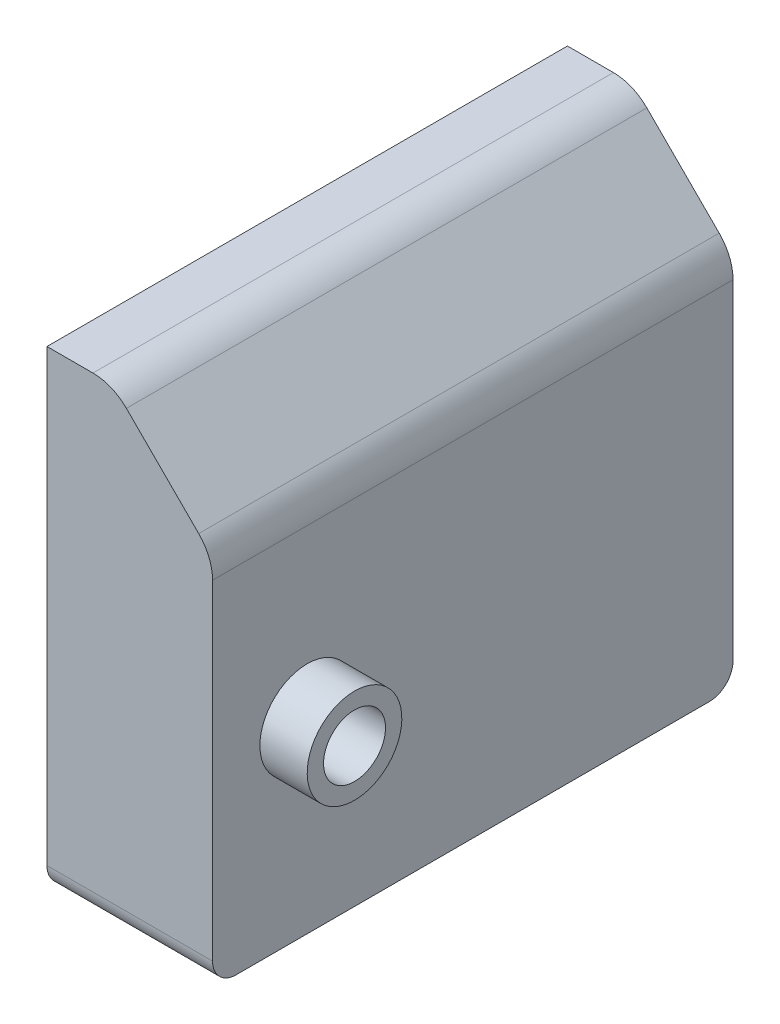
ISO-10303-21;
HEADER;
FILE_DESCRIPTION(('STEP AP214'),'2;1');
FILE_NAME('part.step','',(''),(''),'','','');
FILE_SCHEMA(('AUTOMOTIVE_DESIGN { 1 0 10303 214 1 1 1 1 }'));
ENDSEC;
DATA;
#1=APPLICATION_CONTEXT('core data for automotive mechanical design processes');
#2=APPLICATION_PROTOCOL_DEFINITION('international standard','automotive_design',2000,#1);
#3=PRODUCT_CONTEXT('',#1,'mechanical');
#4=PRODUCT('Part','Part','',(#3));
#5=PRODUCT_RELATED_PRODUCT_CATEGORY('part','',(#4));
#6=PRODUCT_DEFINITION_FORMATION('','',#4);
#7=PRODUCT_DEFINITION_CONTEXT('part definition',#1,'design');
#8=PRODUCT_DEFINITION('design','',#6,#7);
#9=PRODUCT_DEFINITION_SHAPE('','',#8);
#10=(LENGTH_UNIT() NAMED_UNIT(*) SI_UNIT(.MILLI.,.METRE.));
#11=(NAMED_UNIT(*) PLANE_ANGLE_UNIT() SI_UNIT($,.RADIAN.));
#12=(NAMED_UNIT(*) SI_UNIT($,.STERADIAN.) SOLID_ANGLE_UNIT());
#13=UNCERTAINTY_MEASURE_WITH_UNIT(LENGTH_MEASURE(1.E-05),#10,'distance_accuracy_value','');
#14=(GEOMETRIC_REPRESENTATION_CONTEXT(3) GLOBAL_UNCERTAINTY_ASSIGNED_CONTEXT((#13)) GLOBAL_UNIT_ASSIGNED_CONTEXT((#10,
#11,#12)) REPRESENTATION_CONTEXT('',''));
#15=CARTESIAN_POINT('',(0.,0.,0.));
#16=DIRECTION('',(0.,0.,1.));
#17=DIRECTION('',(1.,0.,0.));
#18=AXIS2_PLACEMENT_3D('',#15,#16,#17);
#19=CARTESIAN_POINT('',(1.,-21.7427164815951,-2.));
#20=DIRECTION('',(-1.,0.,0.));
#21=DIRECTION('',(0.,-1.,0.));
#22=AXIS2_PLACEMENT_3D('',#19,#20,#21);
#23=PLANE('',#22);
#24=DIRECTION('',(0.,0.,1.));
#25=VECTOR('',#24,1.);
#26=CARTESIAN_POINT('',(1.,-119.742716481595,-213.948100502086));
#27=LINE('',#26,#25);
#28=CARTESIAN_POINT('',(1.,-119.742716481595,-103.));
#29=VERTEX_POINT('',#28);
#30=CARTESIAN_POINT('',(1.,-119.742716481595,-7.00000000000006));
#31=VERTEX_POINT('',#30);
#32=EDGE_CURVE('E208',#29,#31,#27,.T.);
#33=ORIENTED_EDGE('',*,*,#32,.F.);
#34=CARTESIAN_POINT('',(1.,-114.742716481595,-103.));
#35=DIRECTION('',(-1.,0.,0.));
#36=DIRECTION('',(0.,-1.,0.));
#37=AXIS2_PLACEMENT_3D('',#34,#35,#36);
#38=CIRCLE('',#37,5.);
#39=CARTESIAN_POINT('',(1.,-114.742716481595,-108.));
#40=VERTEX_POINT('',#39);
#41=EDGE_CURVE('E267',#29,#40,#38,.F.);
#42=ORIENTED_EDGE('',*,*,#41,.T.);
#43=DIRECTION('',(0.,1.,0.));
#44=VECTOR('',#43,1.);
#45=CARTESIAN_POINT('',(1.,-121.742716481595,-108.));
#46=LINE('',#45,#44);
#47=CARTESIAN_POINT('',(1.,-23.7427164815951,-108.));
#48=VERTEX_POINT('',#47);
#49=EDGE_CURVE('E192',#40,#48,#46,.T.);
#50=ORIENTED_EDGE('',*,*,#49,.T.);
#51=DIRECTION('',(0.,0.,1.));
#52=VECTOR('',#51,1.);
#53=CARTESIAN_POINT('',(1.,-23.7427164815951,-213.948100502086));
#54=LINE('',#53,#52);
#55=CARTESIAN_POINT('',(1.,-23.7427164815951,-2.));
#56=VERTEX_POINT('',#55);
#57=EDGE_CURVE('E195',#48,#56,#54,.T.);
#58=ORIENTED_EDGE('',*,*,#57,.T.);
#59=DIRECTION('',(0.,-1.,0.));
#60=VECTOR('',#59,1.);
#61=CARTESIAN_POINT('',(1.,-21.7427164815951,-2.));
#62=LINE('',#61,#60);
#63=CARTESIAN_POINT('',(1.,-114.742716481595,-2.));
#64=VERTEX_POINT('',#63);
#65=EDGE_CURVE('E215',#56,#64,#62,.T.);
#66=ORIENTED_EDGE('',*,*,#65,.T.);
#67=CARTESIAN_POINT('',(1.,-114.742716481595,-7.00000000000001));
#68=DIRECTION('',(-1.,0.,0.));
#69=DIRECTION('',(0.,-1.,0.));
#70=AXIS2_PLACEMENT_3D('',#67,#68,#69);
#71=CIRCLE('',#70,5.);
#72=EDGE_CURVE('E265',#64,#31,#71,.F.);
#73=ORIENTED_EDGE('',*,*,#72,.T.);
#74=EDGE_LOOP('',(#33,#42,#50,#58,#66,#73));
#75=FACE_BOUND('',#74,.T.);
#76=DIRECTION('',(0.,1.,0.));
#77=VECTOR('',#76,1.);
#78=CARTESIAN_POINT('',(1.,-121.742716481595,-110.));
#79=LINE('',#78,#77);
#80=CARTESIAN_POINT('',(1.,-116.742716481595,-110.));
#81=VERTEX_POINT('',#80);
#82=CARTESIAN_POINT('',(1.,-21.742716481595,-110.));
#83=VERTEX_POINT('',#82);
#84=EDGE_CURVE('E161',#81,#83,#79,.T.);
#85=ORIENTED_EDGE('',*,*,#84,.F.);
#86=CARTESIAN_POINT('',(1.,-116.742716481595,-105.));
#87=DIRECTION('',(-1.,0.,0.));
#88=DIRECTION('',(0.,-1.,0.));
#89=AXIS2_PLACEMENT_3D('',#86,#87,#88);
#90=CIRCLE('',#89,5.);
#91=CARTESIAN_POINT('',(1.,-121.742716481595,-105.));
#92=VERTEX_POINT('',#91);
#93=EDGE_CURVE('E251',#81,#92,#90,.T.);
#94=ORIENTED_EDGE('',*,*,#93,.T.);
#95=DIRECTION('',(0.,0.,1.));
#96=VECTOR('',#95,1.);
#97=CARTESIAN_POINT('',(1.,-121.742716481595,-2.));
#98=LINE('',#97,#96);
#99=CARTESIAN_POINT('',(1.,-121.742716481595,-5.));
#100=VERTEX_POINT('',#99);
#101=EDGE_CURVE('E218',#92,#100,#98,.T.);
#102=ORIENTED_EDGE('',*,*,#101,.T.);
#103=CARTESIAN_POINT('',(1.,-116.742716481595,-5.));
#104=DIRECTION('',(-1.,0.,0.));
#105=DIRECTION('',(0.,-1.,0.));
#106=AXIS2_PLACEMENT_3D('',#103,#104,#105);
#107=CIRCLE('',#106,5.);
#108=CARTESIAN_POINT('',(1.,-116.742716481595,0.));
#109=VERTEX_POINT('',#108);
#110=EDGE_CURVE('E249',#100,#109,#107,.T.);
#111=ORIENTED_EDGE('',*,*,#110,.T.);
#112=DIRECTION('',(0.,-1.,0.));
#113=VECTOR('',#112,1.);
#114=CARTESIAN_POINT('',(1.,-21.7427164815951,0.));
#115=LINE('',#114,#113);
#116=CARTESIAN_POINT('',(1.,-21.7427164815951,0.));
#117=VERTEX_POINT('',#116);
#118=EDGE_CURVE('E177',#117,#109,#115,.T.);
#119=ORIENTED_EDGE('',*,*,#118,.F.);
#120=DIRECTION('',(0.,0.,1.));
#121=VECTOR('',#120,1.);
#122=CARTESIAN_POINT('',(1.,-21.7427164815951,-2.));
#123=LINE('',#122,#121);
#124=EDGE_CURVE('E175',#83,#117,#123,.T.);
#125=ORIENTED_EDGE('',*,*,#124,.F.);
#126=EDGE_LOOP('',(#85,#94,#102,#111,#119,#125));
#127=FACE_BOUND('',#126,.T.);
#128=ADVANCED_FACE('F33',(#75,#127),#23,.T.);
#129=CARTESIAN_POINT('',(1.,-21.7427164815951,-2.));
#130=DIRECTION('',(0.,1.,0.));
#131=DIRECTION('',(0.,0.,1.));
#132=AXIS2_PLACEMENT_3D('',#129,#130,#131);
#133=PLANE('',#132);
#134=DIRECTION('',(-1.,0.,0.));
#135=VECTOR('',#134,1.);
#136=CARTESIAN_POINT('',(1.,-21.7427164815951,0.));
#137=LINE('',#136,#135);
#138=CARTESIAN_POINT('',(10.7179817021291,-21.7427164815951,0.));
#139=VERTEX_POINT('',#138);
#140=EDGE_CURVE('E219',#139,#117,#137,.T.);
#141=ORIENTED_EDGE('',*,*,#140,.F.);
#142=DIRECTION('',(0.,0.,1.));
#143=VECTOR('',#142,1.);
#144=CARTESIAN_POINT('',(10.7179817021292,-21.7427164815951,-2.));
#145=LINE('',#144,#143);
#146=CARTESIAN_POINT('',(10.7179817021291,-21.742716481595,-110.));
#147=VERTEX_POINT('',#146);
#148=EDGE_CURVE('E11',#139,#147,#145,.F.);
#149=ORIENTED_EDGE('',*,*,#148,.T.);
#150=DIRECTION('',(1.,0.,0.));
#151=VECTOR('',#150,1.);
#152=CARTESIAN_POINT('',(1.,-21.742716481595,-110.));
#153=LINE('',#152,#151);
#154=EDGE_CURVE('E166',#83,#147,#153,.T.);
#155=ORIENTED_EDGE('',*,*,#154,.F.);
#156=ORIENTED_EDGE('',*,*,#124,.T.);
#157=EDGE_LOOP('',(#141,#149,#155,#156));
#158=FACE_BOUND('',#157,.T.);
#159=ADVANCED_FACE('F183',(#158),#133,.T.);
#160=CARTESIAN_POINT('',(14.8601173258601,-21.7427164815951,-2.));
#161=DIRECTION('',(0.707106781186549,0.707106781186546,0.));
#162=DIRECTION('',(-0.707106781186546,0.707106781186549,0.));
#163=AXIS2_PLACEMENT_3D('',#160,#161,#162);
#164=PLANE('',#163);
#165=DIRECTION('',(-0.707106781186546,0.707106781186549,0.));
#166=VECTOR('',#165,1.);
#167=CARTESIAN_POINT('',(14.8601173258601,-21.7427164815951,0.));
#168=LINE('',#167,#166);
#169=CARTESIAN_POINT('',(33.0710678118655,-39.9536669676005,0.));
#170=VERTEX_POINT('',#169);
#171=CARTESIAN_POINT('',(17.7890495139946,-24.6716486697296,0.));
#172=VERTEX_POINT('',#171);
#173=EDGE_CURVE('E224',#170,#172,#168,.T.);
#174=ORIENTED_EDGE('',*,*,#173,.F.);
#175=DIRECTION('',(0.,0.,1.));
#176=VECTOR('',#175,1.);
#177=CARTESIAN_POINT('',(33.0710678118655,-39.9536669676005,-2.));
#178=LINE('',#177,#176);
#179=CARTESIAN_POINT('',(33.0710678118655,-39.9536669676005,-110.));
#180=VERTEX_POINT('',#179);
#181=EDGE_CURVE('E279',#170,#180,#178,.F.);
#182=ORIENTED_EDGE('',*,*,#181,.T.);
#183=DIRECTION('',(0.707106781186546,-0.707106781186549,0.));
#184=VECTOR('',#183,1.);
#185=CARTESIAN_POINT('',(14.8601173258601,-21.742716481595,-110.));
#186=LINE('',#185,#184);
#187=CARTESIAN_POINT('',(17.7890495139947,-24.6716486697296,-110.));
#188=VERTEX_POINT('',#187);
#189=EDGE_CURVE('E185',#188,#180,#186,.T.);
#190=ORIENTED_EDGE('',*,*,#189,.F.);
#191=DIRECTION('',(0.,0.,1.));
#192=VECTOR('',#191,1.);
#193=CARTESIAN_POINT('',(17.7890495139946,-24.6716486697296,-2.));
#194=LINE('',#193,#192);
#195=EDGE_CURVE('E276',#188,#172,#194,.T.);
#196=ORIENTED_EDGE('',*,*,#195,.T.);
#197=EDGE_LOOP('',(#174,#182,#190,#196));
#198=FACE_BOUND('',#197,.T.);
#199=ADVANCED_FACE('F349',(#198),#164,.T.);
#200=CARTESIAN_POINT('',(36.,-42.882599155735,-2.));
#201=DIRECTION('',(1.,0.,0.));
#202=DIRECTION('',(0.,1.,0.));
#203=AXIS2_PLACEMENT_3D('',#200,#201,#202);
#204=PLANE('',#203);
#205=CARTESIAN_POINT('',(36.,-82.3126578186651,-20.));
#206=DIRECTION('',(1.,0.,0.));
#207=DIRECTION('',(0.,1.,0.));
#208=AXIS2_PLACEMENT_3D('',#205,#206,#207);
#209=CIRCLE('',#208,10.);
#210=CARTESIAN_POINT('',(36.,-72.3126578186651,-20.));
#211=VERTEX_POINT('',#210);
#212=EDGE_CURVE('E318',#211,#211,#209,.T.);
#213=ORIENTED_EDGE('',*,*,#212,.F.);
#214=EDGE_LOOP('',(#213));
#215=FACE_BOUND('',#214,.T.);
#216=DIRECTION('',(0.,-1.,0.));
#217=VECTOR('',#216,1.);
#218=CARTESIAN_POINT('',(36.,-42.882599155735,-110.));
#219=LINE('',#218,#217);
#220=CARTESIAN_POINT('',(36.,-47.024734779466,-110.));
#221=VERTEX_POINT('',#220);
#222=CARTESIAN_POINT('',(36.,-116.742716481595,-110.));
#223=VERTEX_POINT('',#222);
#224=EDGE_CURVE('E187',#221,#223,#219,.T.);
#225=ORIENTED_EDGE('',*,*,#224,.F.);
#226=DIRECTION('',(0.,0.,1.));
#227=VECTOR('',#226,1.);
#228=CARTESIAN_POINT('',(36.,-47.024734779466,-2.));
#229=LINE('',#228,#227);
#230=CARTESIAN_POINT('',(36.,-47.024734779466,0.));
#231=VERTEX_POINT('',#230);
#232=EDGE_CURVE('E269',#221,#231,#229,.T.);
#233=ORIENTED_EDGE('',*,*,#232,.T.);
#234=DIRECTION('',(0.,1.,0.));
#235=VECTOR('',#234,1.);
#236=CARTESIAN_POINT('',(36.,-42.882599155735,0.));
#237=LINE('',#236,#235);
#238=CARTESIAN_POINT('',(36.,-116.742716481595,0.));
#239=VERTEX_POINT('',#238);
#240=EDGE_CURVE('E221',#239,#231,#237,.T.);
#241=ORIENTED_EDGE('',*,*,#240,.F.);
#242=CARTESIAN_POINT('',(36.,-116.742716481595,-5.));
#243=DIRECTION('',(1.,0.,0.));
#244=DIRECTION('',(0.,1.,0.));
#245=AXIS2_PLACEMENT_3D('',#242,#243,#244);
#246=CIRCLE('',#245,5.);
#247=CARTESIAN_POINT('',(36.,-121.742716481595,-5.));
#248=VERTEX_POINT('',#247);
#249=EDGE_CURVE('E257',#239,#248,#246,.T.);
#250=ORIENTED_EDGE('',*,*,#249,.T.);
#251=DIRECTION('',(0.,0.,1.));
#252=VECTOR('',#251,1.);
#253=CARTESIAN_POINT('',(36.,-121.742716481595,-2.));
#254=LINE('',#253,#252);
#255=CARTESIAN_POINT('',(36.,-121.742716481595,-105.));
#256=VERTEX_POINT('',#255);
#257=EDGE_CURVE('E181',#256,#248,#254,.T.);
#258=ORIENTED_EDGE('',*,*,#257,.F.);
#259=CARTESIAN_POINT('',(36.,-116.742716481595,-105.));
#260=DIRECTION('',(1.,0.,0.));
#261=DIRECTION('',(0.,1.,0.));
#262=AXIS2_PLACEMENT_3D('',#259,#260,#261);
#263=CIRCLE('',#262,5.);
#264=EDGE_CURVE('E259',#256,#223,#263,.T.);
#265=ORIENTED_EDGE('',*,*,#264,.T.);
#266=EDGE_LOOP('',(#225,#233,#241,#250,#258,#265));
#267=FACE_BOUND('',#266,.T.);
#268=ADVANCED_FACE('F412',(#215,#267),#204,.T.);
#269=CARTESIAN_POINT('',(36.,-121.742716481595,-2.));
#270=DIRECTION('',(0.,-1.,0.));
#271=DIRECTION('',(0.,0.,-1.));
#272=AXIS2_PLACEMENT_3D('',#269,#270,#271);
#273=PLANE('',#272);
#274=ORIENTED_EDGE('',*,*,#101,.F.);
#275=DIRECTION('',(-1.,0.,0.));
#276=VECTOR('',#275,1.);
#277=CARTESIAN_POINT('',(36.,-121.742716481595,-105.));
#278=LINE('',#277,#276);
#279=EDGE_CURVE('E255',#92,#256,#278,.F.);
#280=ORIENTED_EDGE('',*,*,#279,.T.);
#281=ORIENTED_EDGE('',*,*,#257,.T.);
#282=DIRECTION('',(1.,0.,0.));
#283=VECTOR('',#282,1.);
#284=CARTESIAN_POINT('',(1.,-121.742716481595,-5.));
#285=LINE('',#284,#283);
#286=EDGE_CURVE('E253',#248,#100,#285,.F.);
#287=ORIENTED_EDGE('',*,*,#286,.T.);
#288=EDGE_LOOP('',(#274,#280,#281,#287));
#289=FACE_BOUND('',#288,.T.);
#290=ADVANCED_FACE('F353',(#289),#273,.T.);
#291=CARTESIAN_POINT('',(0.,0.,-2.));
#292=DIRECTION('',(0.,0.,-1.));
#293=DIRECTION('',(-1.,0.,0.));
#294=AXIS2_PLACEMENT_3D('',#291,#292,#293);
#295=PLANE('',#294);
#296=DIRECTION('',(-0.707106781186548,0.707106781186548,0.));
#297=VECTOR('',#296,1.);
#298=CARTESIAN_POINT('',(14.0316902011139,-23.7427164815951,-2.));
#299=LINE('',#298,#297);
#300=CARTESIAN_POINT('',(31.0710678118655,-40.7820940923466,-2.));
#301=VERTEX_POINT('',#300);
#302=CARTESIAN_POINT('',(16.9606223892484,-26.6716486697296,-2.));
#303=VERTEX_POINT('',#302);
#304=EDGE_CURVE('E196',#301,#303,#299,.T.);
#305=ORIENTED_EDGE('',*,*,#304,.F.);
#306=CARTESIAN_POINT('',(24.,-47.8531619042121,-2.));
#307=DIRECTION('',(0.,0.,-1.));
#308=DIRECTION('',(-1.,0.,0.));
#309=AXIS2_PLACEMENT_3D('',#306,#307,#308);
#310=CIRCLE('',#309,10.);
#311=CARTESIAN_POINT('',(34.,-47.8531619042121,-2.));
#312=VERTEX_POINT('',#311);
#313=EDGE_CURVE('E292',#301,#312,#310,.T.);
#314=ORIENTED_EDGE('',*,*,#313,.T.);
#315=DIRECTION('',(0.,1.,0.));
#316=VECTOR('',#315,1.);
#317=CARTESIAN_POINT('',(34.,-43.7110262804812,-2.));
#318=LINE('',#317,#316);
#319=CARTESIAN_POINT('',(34.,-114.742716481595,-2.));
#320=VERTEX_POINT('',#319);
#321=EDGE_CURVE('E199',#320,#312,#318,.T.);
#322=ORIENTED_EDGE('',*,*,#321,.F.);
#323=DIRECTION('',(1.,0.,0.));
#324=VECTOR('',#323,1.);
#325=CARTESIAN_POINT('',(0.,-114.742716481595,-2.));
#326=LINE('',#325,#324);
#327=EDGE_CURVE('E243',#320,#64,#326,.F.);
#328=ORIENTED_EDGE('',*,*,#327,.T.);
#329=ORIENTED_EDGE('',*,*,#65,.F.);
#330=DIRECTION('',(-1.,0.,0.));
#331=VECTOR('',#330,1.);
#332=CARTESIAN_POINT('',(1.,-23.7427164815951,-2.));
#333=LINE('',#332,#331);
#334=CARTESIAN_POINT('',(9.88955457738297,-23.7427164815951,-2.));
#335=VERTEX_POINT('',#334);
#336=EDGE_CURVE('E193',#335,#56,#333,.T.);
#337=ORIENTED_EDGE('',*,*,#336,.F.);
#338=CARTESIAN_POINT('',(9.88955457738297,-33.7427164815951,-2.));
#339=DIRECTION('',(0.,0.,-1.));
#340=DIRECTION('',(-1.,0.,0.));
#341=AXIS2_PLACEMENT_3D('',#338,#339,#340);
#342=CIRCLE('',#341,10.);
#343=EDGE_CURVE('E290',#335,#303,#342,.T.);
#344=ORIENTED_EDGE('',*,*,#343,.T.);
#345=EDGE_LOOP('',(#305,#314,#322,#328,#329,#337,#344));
#346=FACE_BOUND('',#345,.T.);
#347=ADVANCED_FACE('F307',(#346),#295,.T.);
#348=CARTESIAN_POINT('',(0.,0.,0.));
#349=DIRECTION('',(0.,0.,-1.));
#350=DIRECTION('',(-1.,0.,0.));
#351=AXIS2_PLACEMENT_3D('',#348,#349,#350);
#352=PLANE('',#351);
#353=ORIENTED_EDGE('',*,*,#240,.T.);
#354=CARTESIAN_POINT('',(26.,-47.024734779466,0.));
#355=DIRECTION('',(0.,0.,-1.));
#356=DIRECTION('',(-1.,0.,0.));
#357=AXIS2_PLACEMENT_3D('',#354,#355,#356);
#358=CIRCLE('',#357,10.);
#359=EDGE_CURVE('E274',#231,#170,#358,.F.);
#360=ORIENTED_EDGE('',*,*,#359,.T.);
#361=ORIENTED_EDGE('',*,*,#173,.T.);
#362=CARTESIAN_POINT('',(10.7179817021292,-31.7427164815951,0.));
#363=DIRECTION('',(0.,0.,-1.));
#364=DIRECTION('',(-1.,0.,0.));
#365=AXIS2_PLACEMENT_3D('',#362,#363,#364);
#366=CIRCLE('',#365,10.);
#367=EDGE_CURVE('E272',#172,#139,#366,.F.);
#368=ORIENTED_EDGE('',*,*,#367,.T.);
#369=ORIENTED_EDGE('',*,*,#140,.T.);
#370=ORIENTED_EDGE('',*,*,#118,.T.);
#371=DIRECTION('',(1.,0.,0.));
#372=VECTOR('',#371,1.);
#373=CARTESIAN_POINT('',(36.,-116.742716481595,0.));
#374=LINE('',#373,#372);
#375=EDGE_CURVE('E262',#109,#239,#374,.T.);
#376=ORIENTED_EDGE('',*,*,#375,.T.);
#377=EDGE_LOOP('',(#353,#360,#361,#368,#369,#370,#376));
#378=FACE_BOUND('',#377,.T.);
#379=ADVANCED_FACE('F398',(#378),#352,.F.);
#380=CARTESIAN_POINT('',(34.,-119.742716481595,-213.948100502086));
#381=DIRECTION('',(0.,-1.,0.));
#382=DIRECTION('',(0.,0.,-1.));
#383=AXIS2_PLACEMENT_3D('',#380,#381,#382);
#384=PLANE('',#383);
#385=ORIENTED_EDGE('',*,*,#32,.T.);
#386=DIRECTION('',(1.,0.,0.));
#387=VECTOR('',#386,1.);
#388=CARTESIAN_POINT('',(34.,-119.742716481595,-7.00000000000001));
#389=LINE('',#388,#387);
#390=CARTESIAN_POINT('',(34.,-119.742716481595,-7.00000000000006));
#391=VERTEX_POINT('',#390);
#392=EDGE_CURVE('E236',#31,#391,#389,.T.);
#393=ORIENTED_EDGE('',*,*,#392,.T.);
#394=DIRECTION('',(0.,0.,1.));
#395=VECTOR('',#394,1.);
#396=CARTESIAN_POINT('',(34.,-119.742716481595,-213.948100502086));
#397=LINE('',#396,#395);
#398=CARTESIAN_POINT('',(34.,-119.742716481595,-103.));
#399=VERTEX_POINT('',#398);
#400=EDGE_CURVE('E201',#399,#391,#397,.T.);
#401=ORIENTED_EDGE('',*,*,#400,.F.);
#402=DIRECTION('',(1.,0.,0.));
#403=VECTOR('',#402,1.);
#404=CARTESIAN_POINT('',(1.,-119.742716481595,-103.));
#405=LINE('',#404,#403);
#406=EDGE_CURVE('E234',#399,#29,#405,.F.);
#407=ORIENTED_EDGE('',*,*,#406,.T.);
#408=EDGE_LOOP('',(#385,#393,#401,#407));
#409=FACE_BOUND('',#408,.T.);
#410=ADVANCED_FACE('F395',(#409),#384,.F.);
#411=CARTESIAN_POINT('',(34.,-43.7110262804812,-213.948100502086));
#412=DIRECTION('',(1.,0.,0.));
#413=DIRECTION('',(0.,0.,-1.));
#414=AXIS2_PLACEMENT_3D('',#411,#412,#413);
#415=PLANE('',#414);
#416=ORIENTED_EDGE('',*,*,#321,.T.);
#417=DIRECTION('',(0.,0.,1.));
#418=VECTOR('',#417,1.);
#419=CARTESIAN_POINT('',(34.,-47.8531619042121,-108.));
#420=LINE('',#419,#418);
#421=CARTESIAN_POINT('',(34.,-47.8531619042121,-108.));
#422=VERTEX_POINT('',#421);
#423=EDGE_CURVE('E56',#312,#422,#420,.F.);
#424=ORIENTED_EDGE('',*,*,#423,.T.);
#425=DIRECTION('',(0.,1.,0.));
#426=VECTOR('',#425,1.);
#427=CARTESIAN_POINT('',(34.,-43.7110262804812,-108.));
#428=LINE('',#427,#426);
#429=CARTESIAN_POINT('',(34.,-114.742716481595,-108.));
#430=VERTEX_POINT('',#429);
#431=EDGE_CURVE('E206',#430,#422,#428,.T.);
#432=ORIENTED_EDGE('',*,*,#431,.F.);
#433=CARTESIAN_POINT('',(34.,-114.742716481595,-103.));
#434=DIRECTION('',(1.,0.,0.));
#435=DIRECTION('',(0.,0.,-1.));
#436=AXIS2_PLACEMENT_3D('',#433,#434,#435);
#437=CIRCLE('',#436,5.);
#438=EDGE_CURVE('E239',#430,#399,#437,.F.);
#439=ORIENTED_EDGE('',*,*,#438,.T.);
#440=ORIENTED_EDGE('',*,*,#400,.T.);
#441=CARTESIAN_POINT('',(34.,-114.742716481595,-7.00000000000001));
#442=DIRECTION('',(1.,0.,0.));
#443=DIRECTION('',(0.,0.,-1.));
#444=AXIS2_PLACEMENT_3D('',#441,#442,#443);
#445=CIRCLE('',#444,5.);
#446=EDGE_CURVE('E241',#391,#320,#445,.F.);
#447=ORIENTED_EDGE('',*,*,#446,.T.);
#448=EDGE_LOOP('',(#416,#424,#432,#439,#440,#447));
#449=FACE_BOUND('',#448,.T.);
#450=ADVANCED_FACE('F391',(#449),#415,.F.);
#451=CARTESIAN_POINT('',(14.0316902011139,-23.7427164815951,-213.948100502086));
#452=DIRECTION('',(0.707106781186547,0.707106781186547,0.));
#453=DIRECTION('',(-0.707106781186548,0.707106781186548,0.));
#454=AXIS2_PLACEMENT_3D('',#451,#452,#453);
#455=PLANE('',#454);
#456=DIRECTION('',(-0.707106781186548,0.707106781186548,0.));
#457=VECTOR('',#456,1.);
#458=CARTESIAN_POINT('',(14.0316902011139,-23.7427164815951,-108.));
#459=LINE('',#458,#457);
#460=CARTESIAN_POINT('',(31.0710678118655,-40.7820940923466,-108.));
#461=VERTEX_POINT('',#460);
#462=CARTESIAN_POINT('',(16.9606223892484,-26.6716486697296,-108.));
#463=VERTEX_POINT('',#462);
#464=EDGE_CURVE('E204',#461,#463,#459,.T.);
#465=ORIENTED_EDGE('',*,*,#464,.F.);
#466=DIRECTION('',(0.,0.,1.));
#467=VECTOR('',#466,1.);
#468=CARTESIAN_POINT('',(31.0710678118655,-40.7820940923466,-2.));
#469=LINE('',#468,#467);
#470=EDGE_CURVE('E287',#461,#301,#469,.T.);
#471=ORIENTED_EDGE('',*,*,#470,.T.);
#472=ORIENTED_EDGE('',*,*,#304,.T.);
#473=DIRECTION('',(0.,0.,1.));
#474=VECTOR('',#473,1.);
#475=CARTESIAN_POINT('',(16.9606223892484,-26.6716486697296,-108.));
#476=LINE('',#475,#474);
#477=EDGE_CURVE('E285',#303,#463,#476,.F.);
#478=ORIENTED_EDGE('',*,*,#477,.T.);
#479=EDGE_LOOP('',(#465,#471,#472,#478));
#480=FACE_BOUND('',#479,.T.);
#481=ADVANCED_FACE('F388',(#480),#455,.F.);
#482=CARTESIAN_POINT('',(1.,-23.7427164815951,-213.948100502086));
#483=DIRECTION('',(0.,1.,0.));
#484=DIRECTION('',(0.,0.,1.));
#485=AXIS2_PLACEMENT_3D('',#482,#483,#484);
#486=PLANE('',#485);
#487=DIRECTION('',(-1.,0.,0.));
#488=VECTOR('',#487,1.);
#489=CARTESIAN_POINT('',(1.,-23.7427164815951,-108.));
#490=LINE('',#489,#488);
#491=CARTESIAN_POINT('',(9.88955457738297,-23.7427164815951,-108.));
#492=VERTEX_POINT('',#491);
#493=EDGE_CURVE('E202',#492,#48,#490,.T.);
#494=ORIENTED_EDGE('',*,*,#493,.F.);
#495=DIRECTION('',(0.,0.,1.));
#496=VECTOR('',#495,1.);
#497=CARTESIAN_POINT('',(9.88955457738297,-23.7427164815951,-2.));
#498=LINE('',#497,#496);
#499=EDGE_CURVE('E41',#492,#335,#498,.T.);
#500=ORIENTED_EDGE('',*,*,#499,.T.);
#501=ORIENTED_EDGE('',*,*,#336,.T.);
#502=ORIENTED_EDGE('',*,*,#57,.F.);
#503=EDGE_LOOP('',(#494,#500,#501,#502));
#504=FACE_BOUND('',#503,.T.);
#505=ADVANCED_FACE('F301',(#504),#486,.F.);
#506=CARTESIAN_POINT('',(0.,0.,-108.));
#507=DIRECTION('',(0.,0.,-1.));
#508=DIRECTION('',(0.,1.,0.));
#509=AXIS2_PLACEMENT_3D('',#506,#507,#508);
#510=PLANE('',#509);
#511=ORIENTED_EDGE('',*,*,#431,.T.);
#512=CARTESIAN_POINT('',(24.,-47.8531619042121,-108.));
#513=DIRECTION('',(0.,0.,-1.));
#514=DIRECTION('',(0.,1.,0.));
#515=AXIS2_PLACEMENT_3D('',#512,#513,#514);
#516=CIRCLE('',#515,10.);
#517=EDGE_CURVE('E296',#422,#461,#516,.F.);
#518=ORIENTED_EDGE('',*,*,#517,.T.);
#519=ORIENTED_EDGE('',*,*,#464,.T.);
#520=CARTESIAN_POINT('',(9.88955457738297,-33.7427164815951,-108.));
#521=DIRECTION('',(0.,0.,-1.));
#522=DIRECTION('',(0.,1.,0.));
#523=AXIS2_PLACEMENT_3D('',#520,#521,#522);
#524=CIRCLE('',#523,10.);
#525=EDGE_CURVE('E48',#463,#492,#524,.F.);
#526=ORIENTED_EDGE('',*,*,#525,.T.);
#527=ORIENTED_EDGE('',*,*,#493,.T.);
#528=ORIENTED_EDGE('',*,*,#49,.F.);
#529=DIRECTION('',(1.,0.,0.));
#530=VECTOR('',#529,1.);
#531=CARTESIAN_POINT('',(34.,-114.742716481595,-108.));
#532=LINE('',#531,#530);
#533=EDGE_CURVE('E245',#40,#430,#532,.T.);
#534=ORIENTED_EDGE('',*,*,#533,.T.);
#535=EDGE_LOOP('',(#511,#518,#519,#526,#527,#528,#534));
#536=FACE_BOUND('',#535,.T.);
#537=ADVANCED_FACE('F341',(#536),#510,.F.);
#538=CARTESIAN_POINT('',(0.,0.,-110.));
#539=DIRECTION('',(0.,0.,-1.));
#540=DIRECTION('',(0.,1.,0.));
#541=AXIS2_PLACEMENT_3D('',#538,#539,#540);
#542=PLANE('',#541);
#543=ORIENTED_EDGE('',*,*,#189,.T.);
#544=CARTESIAN_POINT('',(26.,-47.024734779466,-110.));
#545=DIRECTION('',(0.,0.,-1.));
#546=DIRECTION('',(0.,1.,0.));
#547=AXIS2_PLACEMENT_3D('',#544,#545,#546);
#548=CIRCLE('',#547,10.);
#549=EDGE_CURVE('E283',#180,#221,#548,.T.);
#550=ORIENTED_EDGE('',*,*,#549,.T.);
#551=ORIENTED_EDGE('',*,*,#224,.T.);
#552=DIRECTION('',(-1.,0.,0.));
#553=VECTOR('',#552,1.);
#554=CARTESIAN_POINT('',(0.,-116.742716481595,-110.));
#555=LINE('',#554,#553);
#556=EDGE_CURVE('E169',#223,#81,#555,.T.);
#557=ORIENTED_EDGE('',*,*,#556,.T.);
#558=ORIENTED_EDGE('',*,*,#84,.T.);
#559=ORIENTED_EDGE('',*,*,#154,.T.);
#560=CARTESIAN_POINT('',(10.7179817021292,-31.7427164815951,-110.));
#561=DIRECTION('',(0.,0.,-1.));
#562=DIRECTION('',(0.,1.,0.));
#563=AXIS2_PLACEMENT_3D('',#560,#561,#562);
#564=CIRCLE('',#563,10.);
#565=EDGE_CURVE('E281',#147,#188,#564,.T.);
#566=ORIENTED_EDGE('',*,*,#565,.T.);
#567=EDGE_LOOP('',(#543,#550,#551,#557,#558,#559,#566));
#568=FACE_BOUND('',#567,.T.);
#569=ADVANCED_FACE('F164',(#568),#542,.T.);
#570=CARTESIAN_POINT('',(46.,-82.3126578186651,-20.));
#571=DIRECTION('',(1.,0.,0.));
#572=DIRECTION('',(0.,1.,0.));
#573=AXIS2_PLACEMENT_3D('',#570,#571,#572);
#574=PLANE('',#573);
#575=CARTESIAN_POINT('',(46.,-82.3126578186651,-20.));
#576=DIRECTION('',(1.,0.,0.));
#577=DIRECTION('',(0.,1.,0.));
#578=AXIS2_PLACEMENT_3D('',#575,#576,#577);
#579=CIRCLE('',#578,10.);
#580=CARTESIAN_POINT('',(46.,-72.3126578186651,-20.));
#581=VERTEX_POINT('',#580);
#582=EDGE_CURVE('E171',#581,#581,#579,.T.);
#583=ORIENTED_EDGE('',*,*,#582,.T.);
#584=EDGE_LOOP('',(#583));
#585=FACE_BOUND('',#584,.T.);
#586=CARTESIAN_POINT('',(46.,-82.3126578186651,-20.));
#587=DIRECTION('',(1.,0.,0.));
#588=DIRECTION('',(0.,1.,0.));
#589=AXIS2_PLACEMENT_3D('',#586,#587,#588);
#590=CIRCLE('',#589,6.55);
#591=CARTESIAN_POINT('',(46.,-75.7626578186651,-20.));
#592=VERTEX_POINT('',#591);
#593=EDGE_CURVE('E321',#592,#592,#590,.T.);
#594=ORIENTED_EDGE('',*,*,#593,.F.);
#595=EDGE_LOOP('',(#594));
#596=FACE_BOUND('',#595,.T.);
#597=ADVANCED_FACE('F330',(#585,#596),#574,.T.);
#598=CARTESIAN_POINT('',(46.,-82.3126578186651,-20.));
#599=DIRECTION('',(-1.,0.,0.));
#600=DIRECTION('',(0.,-1.,0.));
#601=AXIS2_PLACEMENT_3D('',#598,#599,#600);
#602=CYLINDRICAL_SURFACE('',#601,10.);
#603=ORIENTED_EDGE('',*,*,#582,.F.);
#604=EDGE_LOOP('',(#603));
#605=FACE_BOUND('',#604,.T.);
#606=ORIENTED_EDGE('',*,*,#212,.T.);
#607=EDGE_LOOP('',(#606));
#608=FACE_BOUND('',#607,.T.);
#609=ADVANCED_FACE('F332',(#605,#608),#602,.T.);
#610=CARTESIAN_POINT('',(46.,-82.3126578186651,-20.));
#611=DIRECTION('',(-1.,0.,0.));
#612=DIRECTION('',(0.,-1.,0.));
#613=AXIS2_PLACEMENT_3D('',#610,#611,#612);
#614=CYLINDRICAL_SURFACE('',#613,6.55);
#615=ORIENTED_EDGE('',*,*,#593,.T.);
#616=EDGE_LOOP('',(#615));
#617=FACE_BOUND('',#616,.T.);
#618=CARTESIAN_POINT('',(36.,-82.3126578186651,-20.));
#619=DIRECTION('',(1.,0.,0.));
#620=DIRECTION('',(0.,1.,0.));
#621=AXIS2_PLACEMENT_3D('',#618,#619,#620);
#622=CIRCLE('',#621,6.55);
#623=CARTESIAN_POINT('',(36.,-75.7626578186651,-20.));
#624=VERTEX_POINT('',#623);
#625=EDGE_CURVE('E180',#624,#624,#622,.F.);
#626=ORIENTED_EDGE('',*,*,#625,.T.);
#627=EDGE_LOOP('',(#626));
#628=FACE_BOUND('',#627,.T.);
#629=ADVANCED_FACE('F327',(#617,#628),#614,.F.);
#630=ORIENTED_EDGE('',*,*,#625,.F.);
#631=EDGE_LOOP('',(#630));
#632=FACE_BOUND('',#631,.T.);
#633=ADVANCED_FACE('F359',(#632),#204,.T.);
#634=CARTESIAN_POINT('',(34.,-114.742716481595,-7.00000000000001));
#635=DIRECTION('',(1.,0.,0.));
#636=DIRECTION('',(0.,0.,-1.));
#637=AXIS2_PLACEMENT_3D('',#634,#635,#636);
#638=CYLINDRICAL_SURFACE('',#637,5.);
#639=ORIENTED_EDGE('',*,*,#72,.F.);
#640=ORIENTED_EDGE('',*,*,#327,.F.);
#641=ORIENTED_EDGE('',*,*,#446,.F.);
#642=ORIENTED_EDGE('',*,*,#392,.F.);
#643=EDGE_LOOP('',(#639,#640,#641,#642));
#644=FACE_BOUND('',#643,.T.);
#645=ADVANCED_FACE('F355',(#644),#638,.F.);
#646=CARTESIAN_POINT('',(0.,-114.742716481595,-103.));
#647=DIRECTION('',(-1.,0.,0.));
#648=DIRECTION('',(0.,0.,1.));
#649=AXIS2_PLACEMENT_3D('',#646,#647,#648);
#650=CYLINDRICAL_SURFACE('',#649,5.);
#651=ORIENTED_EDGE('',*,*,#41,.F.);
#652=ORIENTED_EDGE('',*,*,#406,.F.);
#653=ORIENTED_EDGE('',*,*,#438,.F.);
#654=ORIENTED_EDGE('',*,*,#533,.F.);
#655=EDGE_LOOP('',(#651,#652,#653,#654));
#656=FACE_BOUND('',#655,.T.);
#657=ADVANCED_FACE('F358',(#656),#650,.F.);
#658=CARTESIAN_POINT('',(0.,-116.742716481595,-105.));
#659=DIRECTION('',(-1.,0.,0.));
#660=DIRECTION('',(0.,0.,1.));
#661=AXIS2_PLACEMENT_3D('',#658,#659,#660);
#662=CYLINDRICAL_SURFACE('',#661,5.);
#663=ORIENTED_EDGE('',*,*,#264,.F.);
#664=ORIENTED_EDGE('',*,*,#279,.F.);
#665=ORIENTED_EDGE('',*,*,#93,.F.);
#666=ORIENTED_EDGE('',*,*,#556,.F.);
#667=EDGE_LOOP('',(#663,#664,#665,#666));
#668=FACE_BOUND('',#667,.T.);
#669=ADVANCED_FACE('F363',(#668),#662,.T.);
#670=CARTESIAN_POINT('',(0.,-116.742716481595,-5.));
#671=DIRECTION('',(-1.,0.,0.));
#672=DIRECTION('',(0.,0.,1.));
#673=AXIS2_PLACEMENT_3D('',#670,#671,#672);
#674=CYLINDRICAL_SURFACE('',#673,5.);
#675=ORIENTED_EDGE('',*,*,#110,.F.);
#676=ORIENTED_EDGE('',*,*,#286,.F.);
#677=ORIENTED_EDGE('',*,*,#249,.F.);
#678=ORIENTED_EDGE('',*,*,#375,.F.);
#679=EDGE_LOOP('',(#675,#676,#677,#678));
#680=FACE_BOUND('',#679,.T.);
#681=ADVANCED_FACE('F367',(#680),#674,.T.);
#682=CARTESIAN_POINT('',(26.,-47.024734779466,-2.));
#683=DIRECTION('',(0.,0.,1.));
#684=DIRECTION('',(1.,0.,0.));
#685=AXIS2_PLACEMENT_3D('',#682,#683,#684);
#686=CYLINDRICAL_SURFACE('',#685,10.);
#687=ORIENTED_EDGE('',*,*,#549,.F.);
#688=ORIENTED_EDGE('',*,*,#181,.F.);
#689=ORIENTED_EDGE('',*,*,#359,.F.);
#690=ORIENTED_EDGE('',*,*,#232,.F.);
#691=EDGE_LOOP('',(#687,#688,#689,#690));
#692=FACE_BOUND('',#691,.T.);
#693=ADVANCED_FACE('F371',(#692),#686,.T.);
#694=CARTESIAN_POINT('',(24.,-47.8531619042121,-213.948100502086));
#695=DIRECTION('',(0.,0.,-1.));
#696=DIRECTION('',(-1.,0.,0.));
#697=AXIS2_PLACEMENT_3D('',#694,#695,#696);
#698=CYLINDRICAL_SURFACE('',#697,10.);
#699=ORIENTED_EDGE('',*,*,#517,.F.);
#700=ORIENTED_EDGE('',*,*,#423,.F.);
#701=ORIENTED_EDGE('',*,*,#313,.F.);
#702=ORIENTED_EDGE('',*,*,#470,.F.);
#703=EDGE_LOOP('',(#699,#700,#701,#702));
#704=FACE_BOUND('',#703,.T.);
#705=ADVANCED_FACE('F375',(#704),#698,.F.);
#706=CARTESIAN_POINT('',(9.88955457738297,-33.7427164815951,-213.948100502086));
#707=DIRECTION('',(0.,0.,-1.));
#708=DIRECTION('',(-1.,0.,0.));
#709=AXIS2_PLACEMENT_3D('',#706,#707,#708);
#710=CYLINDRICAL_SURFACE('',#709,10.);
#711=ORIENTED_EDGE('',*,*,#525,.F.);
#712=ORIENTED_EDGE('',*,*,#477,.F.);
#713=ORIENTED_EDGE('',*,*,#343,.F.);
#714=ORIENTED_EDGE('',*,*,#499,.F.);
#715=EDGE_LOOP('',(#711,#712,#713,#714));
#716=FACE_BOUND('',#715,.T.);
#717=ADVANCED_FACE('F378',(#716),#710,.F.);
#718=CARTESIAN_POINT('',(10.7179817021292,-31.7427164815951,-2.));
#719=DIRECTION('',(0.,0.,1.));
#720=DIRECTION('',(1.,0.,0.));
#721=AXIS2_PLACEMENT_3D('',#718,#719,#720);
#722=CYLINDRICAL_SURFACE('',#721,10.);
#723=ORIENTED_EDGE('',*,*,#565,.F.);
#724=ORIENTED_EDGE('',*,*,#148,.F.);
#725=ORIENTED_EDGE('',*,*,#367,.F.);
#726=ORIENTED_EDGE('',*,*,#195,.F.);
#727=EDGE_LOOP('',(#723,#724,#725,#726));
#728=FACE_BOUND('',#727,.T.);
#729=ADVANCED_FACE('F35',(#728),#722,.T.);
#730=CLOSED_SHELL('',(#128,#159,#199,#268,#290,#347,#379,#410,#450,#481,#505,#537,#569,#597,
#609,#629,#633,#645,#657,#669,#681,#693,#705,#717,#729));
#731=MANIFOLD_SOLID_BREP('B2',#730);
#732=ADVANCED_BREP_SHAPE_REPRESENTATION('',(#18,#731),#14);
#733=SHAPE_DEFINITION_REPRESENTATION(#9,#732);
ENDSEC;
END-ISO-10303-21;
